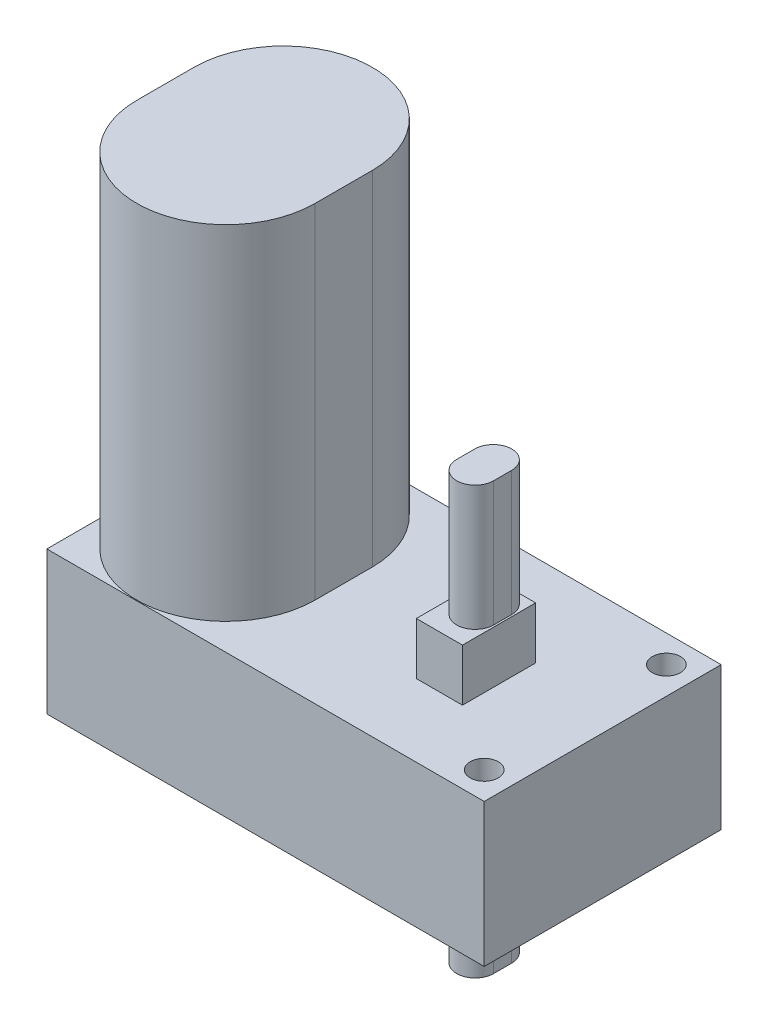
ISO-10303-21;
HEADER;
FILE_DESCRIPTION(('STEP AP214'),'2;1');
FILE_NAME('part.step','',(''),(''),'','','');
FILE_SCHEMA(('AUTOMOTIVE_DESIGN { 1 0 10303 214 1 1 1 1 }'));
ENDSEC;
DATA;
#1=APPLICATION_CONTEXT('core data for automotive mechanical design processes');
#2=APPLICATION_PROTOCOL_DEFINITION('international standard','automotive_design',2000,#1);
#3=PRODUCT_CONTEXT('',#1,'mechanical');
#4=PRODUCT('Part','Part','',(#3));
#5=PRODUCT_RELATED_PRODUCT_CATEGORY('part','',(#4));
#6=PRODUCT_DEFINITION_FORMATION('','',#4);
#7=PRODUCT_DEFINITION_CONTEXT('part definition',#1,'design');
#8=PRODUCT_DEFINITION('design','',#6,#7);
#9=PRODUCT_DEFINITION_SHAPE('','',#8);
#10=(LENGTH_UNIT() NAMED_UNIT(*) SI_UNIT(.MILLI.,.METRE.));
#11=(NAMED_UNIT(*) PLANE_ANGLE_UNIT() SI_UNIT($,.RADIAN.));
#12=(NAMED_UNIT(*) SI_UNIT($,.STERADIAN.) SOLID_ANGLE_UNIT());
#13=UNCERTAINTY_MEASURE_WITH_UNIT(LENGTH_MEASURE(1.E-05),#10,'distance_accuracy_value','');
#14=(GEOMETRIC_REPRESENTATION_CONTEXT(3) GLOBAL_UNCERTAINTY_ASSIGNED_CONTEXT((#13)) GLOBAL_UNIT_ASSIGNED_CONTEXT((#10,
#11,#12)) REPRESENTATION_CONTEXT('',''));
#15=CARTESIAN_POINT('',(0.,0.,0.));
#16=DIRECTION('',(0.,0.,1.));
#17=DIRECTION('',(1.,0.,0.));
#18=AXIS2_PLACEMENT_3D('',#15,#16,#17);
#19=CARTESIAN_POINT('',(0.,13.73,0.));
#20=DIRECTION('',(0.,-1.,0.));
#21=DIRECTION('',(0.,0.,-1.));
#22=AXIS2_PLACEMENT_3D('',#19,#20,#21);
#23=PLANE('',#22);
#24=CARTESIAN_POINT('',(-12.435,13.73,2.75));
#25=DIRECTION('',(0.,1.,0.));
#26=DIRECTION('',(0.,0.,1.));
#27=AXIS2_PLACEMENT_3D('',#24,#25,#26);
#28=CIRCLE('',#27,8.57);
#29=CARTESIAN_POINT('',(-21.005,13.73,2.75));
#30=VERTEX_POINT('',#29);
#31=CARTESIAN_POINT('',(-3.865,13.73,2.75));
#32=VERTEX_POINT('',#31);
#33=EDGE_CURVE('E241',#30,#32,#28,.T.);
#34=ORIENTED_EDGE('',*,*,#33,.F.);
#35=DIRECTION('',(0.,0.,1.));
#36=VECTOR('',#35,1.);
#37=CARTESIAN_POINT('',(-21.005,13.73,11.38));
#38=LINE('',#37,#36);
#39=CARTESIAN_POINT('',(-21.005,13.73,11.38));
#40=VERTEX_POINT('',#39);
#41=EDGE_CURVE('E345',#30,#40,#38,.T.);
#42=ORIENTED_EDGE('',*,*,#41,.T.);
#43=DIRECTION('',(1.,0.,0.));
#44=VECTOR('',#43,1.);
#45=CARTESIAN_POINT('',(-21.005,13.73,11.38));
#46=LINE('',#45,#44);
#47=CARTESIAN_POINT('',(21.005,13.73,11.38));
#48=VERTEX_POINT('',#47);
#49=EDGE_CURVE('E328',#40,#48,#46,.T.);
#50=ORIENTED_EDGE('',*,*,#49,.T.);
#51=DIRECTION('',(0.,0.,-1.));
#52=VECTOR('',#51,1.);
#53=CARTESIAN_POINT('',(21.005,13.73,11.38));
#54=LINE('',#53,#52);
#55=CARTESIAN_POINT('',(21.005,13.73,-11.38));
#56=VERTEX_POINT('',#55);
#57=EDGE_CURVE('E333',#48,#56,#54,.T.);
#58=ORIENTED_EDGE('',*,*,#57,.T.);
#59=DIRECTION('',(-1.,0.,0.));
#60=VECTOR('',#59,1.);
#61=CARTESIAN_POINT('',(-21.005,13.73,-11.38));
#62=LINE('',#61,#60);
#63=CARTESIAN_POINT('',(-21.005,13.73,-11.38));
#64=VERTEX_POINT('',#63);
#65=EDGE_CURVE('E349',#56,#64,#62,.T.);
#66=ORIENTED_EDGE('',*,*,#65,.T.);
#67=CARTESIAN_POINT('',(-21.005,13.73,-2.75));
#68=VERTEX_POINT('',#67);
#69=EDGE_CURVE('E343',#64,#68,#38,.T.);
#70=ORIENTED_EDGE('',*,*,#69,.T.);
#71=CARTESIAN_POINT('',(-12.435,13.73,-2.75));
#72=DIRECTION('',(0.,1.,0.));
#73=DIRECTION('',(0.,0.,1.));
#74=AXIS2_PLACEMENT_3D('',#71,#72,#73);
#75=CIRCLE('',#74,8.57);
#76=CARTESIAN_POINT('',(-3.86500000000001,13.73,-2.75));
#77=VERTEX_POINT('',#76);
#78=EDGE_CURVE('E258',#77,#68,#75,.T.);
#79=ORIENTED_EDGE('',*,*,#78,.F.);
#80=DIRECTION('',(0.,0.,-1.));
#81=VECTOR('',#80,1.);
#82=CARTESIAN_POINT('',(-3.865,13.73,2.75));
#83=LINE('',#82,#81);
#84=EDGE_CURVE('E265',#32,#77,#83,.T.);
#85=ORIENTED_EDGE('',*,*,#84,.F.);
#86=EDGE_LOOP('',(#34,#42,#50,#58,#66,#70,#79,#85));
#87=FACE_BOUND('',#86,.T.);
#88=CARTESIAN_POINT('',(18.375,13.73,-8.75));
#89=DIRECTION('',(0.,1.,0.));
#90=DIRECTION('',(0.,0.,1.));
#91=AXIS2_PLACEMENT_3D('',#88,#89,#90);
#92=CIRCLE('',#91,1.35);
#93=CARTESIAN_POINT('',(18.375,13.73,-7.4));
#94=VERTEX_POINT('',#93);
#95=EDGE_CURVE('E209',#94,#94,#92,.T.);
#96=ORIENTED_EDGE('',*,*,#95,.F.);
#97=EDGE_LOOP('',(#96));
#98=FACE_BOUND('',#97,.T.);
#99=CARTESIAN_POINT('',(18.375,13.73,8.75));
#100=DIRECTION('',(0.,1.,0.));
#101=DIRECTION('',(0.,0.,1.));
#102=AXIS2_PLACEMENT_3D('',#99,#100,#101);
#103=CIRCLE('',#102,1.35);
#104=CARTESIAN_POINT('',(18.375,13.73,10.1));
#105=VERTEX_POINT('',#104);
#106=EDGE_CURVE('E205',#105,#105,#103,.T.);
#107=ORIENTED_EDGE('',*,*,#106,.F.);
#108=EDGE_LOOP('',(#107));
#109=FACE_BOUND('',#108,.T.);
#110=DIRECTION('',(0.,0.,-1.));
#111=VECTOR('',#110,1.);
#112=CARTESIAN_POINT('',(11.9556320566407,13.73,4.418986760788));
#113=LINE('',#112,#111);
#114=CARTESIAN_POINT('',(11.9556320566407,13.73,4.418986760788));
#115=VERTEX_POINT('',#114);
#116=CARTESIAN_POINT('',(11.9556320566407,13.73,-2.60917707476871));
#117=VERTEX_POINT('',#116);
#118=EDGE_CURVE('E190',#115,#117,#113,.T.);
#119=ORIENTED_EDGE('',*,*,#118,.F.);
#120=DIRECTION('',(1.,0.,0.));
#121=VECTOR('',#120,1.);
#122=CARTESIAN_POINT('',(7.52449972946279,13.73,4.418986760788));
#123=LINE('',#122,#121);
#124=CARTESIAN_POINT('',(7.52449972946279,13.73,4.418986760788));
#125=VERTEX_POINT('',#124);
#126=EDGE_CURVE('E187',#125,#115,#123,.T.);
#127=ORIENTED_EDGE('',*,*,#126,.F.);
#128=DIRECTION('',(0.,0.,1.));
#129=VECTOR('',#128,1.);
#130=CARTESIAN_POINT('',(7.52449972946279,13.73,4.418986760788));
#131=LINE('',#130,#129);
#132=CARTESIAN_POINT('',(7.52449972946279,13.73,-2.60917707476871));
#133=VERTEX_POINT('',#132);
#134=EDGE_CURVE('E53',#133,#125,#131,.T.);
#135=ORIENTED_EDGE('',*,*,#134,.F.);
#136=DIRECTION('',(-1.,0.,0.));
#137=VECTOR('',#136,1.);
#138=CARTESIAN_POINT('',(7.52449972946279,13.73,-2.60917707476871));
#139=LINE('',#138,#137);
#140=EDGE_CURVE('E48',#117,#133,#139,.T.);
#141=ORIENTED_EDGE('',*,*,#140,.F.);
#142=EDGE_LOOP('',(#119,#127,#135,#141));
#143=FACE_BOUND('',#142,.T.);
#144=ADVANCED_FACE('F33',(#87,#98,#109,#143),#23,.F.);
#145=CARTESIAN_POINT('',(21.005,13.73,11.38));
#146=DIRECTION('',(-1.,0.,0.));
#147=DIRECTION('',(0.,0.,1.));
#148=AXIS2_PLACEMENT_3D('',#145,#146,#147);
#149=PLANE('',#148);
#150=DIRECTION('',(0.,0.,-1.));
#151=VECTOR('',#150,1.);
#152=CARTESIAN_POINT('',(21.005,0.,11.38));
#153=LINE('',#152,#151);
#154=CARTESIAN_POINT('',(21.005,0.,11.38));
#155=VERTEX_POINT('',#154);
#156=CARTESIAN_POINT('',(21.005,0.,-11.38));
#157=VERTEX_POINT('',#156);
#158=EDGE_CURVE('E314',#155,#157,#153,.T.);
#159=ORIENTED_EDGE('',*,*,#158,.T.);
#160=DIRECTION('',(0.,-1.,0.));
#161=VECTOR('',#160,1.);
#162=CARTESIAN_POINT('',(21.005,13.73,-11.38));
#163=LINE('',#162,#161);
#164=EDGE_CURVE('E287',#56,#157,#163,.T.);
#165=ORIENTED_EDGE('',*,*,#164,.F.);
#166=ORIENTED_EDGE('',*,*,#57,.F.);
#167=DIRECTION('',(0.,-1.,0.));
#168=VECTOR('',#167,1.);
#169=CARTESIAN_POINT('',(21.005,13.73,11.38));
#170=LINE('',#169,#168);
#171=EDGE_CURVE('E334',#48,#155,#170,.T.);
#172=ORIENTED_EDGE('',*,*,#171,.T.);
#173=EDGE_LOOP('',(#159,#165,#166,#172));
#174=FACE_BOUND('',#173,.T.);
#175=ADVANCED_FACE('F35',(#174),#149,.F.);
#176=CARTESIAN_POINT('',(-21.005,13.73,-11.38));
#177=DIRECTION('',(0.,0.,1.));
#178=DIRECTION('',(1.,0.,0.));
#179=AXIS2_PLACEMENT_3D('',#176,#177,#178);
#180=PLANE('',#179);
#181=DIRECTION('',(-1.,0.,0.));
#182=VECTOR('',#181,1.);
#183=CARTESIAN_POINT('',(-21.005,0.,-11.38));
#184=LINE('',#183,#182);
#185=CARTESIAN_POINT('',(-21.005,0.,-11.38));
#186=VERTEX_POINT('',#185);
#187=EDGE_CURVE('E317',#157,#186,#184,.T.);
#188=ORIENTED_EDGE('',*,*,#187,.T.);
#189=DIRECTION('',(0.,-1.,0.));
#190=VECTOR('',#189,1.);
#191=CARTESIAN_POINT('',(-21.005,13.73,-11.38));
#192=LINE('',#191,#190);
#193=EDGE_CURVE('E339',#64,#186,#192,.T.);
#194=ORIENTED_EDGE('',*,*,#193,.F.);
#195=ORIENTED_EDGE('',*,*,#65,.F.);
#196=ORIENTED_EDGE('',*,*,#164,.T.);
#197=EDGE_LOOP('',(#188,#194,#195,#196));
#198=FACE_BOUND('',#197,.T.);
#199=ADVANCED_FACE('F360',(#198),#180,.F.);
#200=CARTESIAN_POINT('',(-21.005,13.73,11.38));
#201=DIRECTION('',(1.,0.,0.));
#202=DIRECTION('',(0.,0.,-1.));
#203=AXIS2_PLACEMENT_3D('',#200,#201,#202);
#204=PLANE('',#203);
#205=DIRECTION('',(0.,0.,1.));
#206=VECTOR('',#205,1.);
#207=CARTESIAN_POINT('',(-21.005,0.,11.38));
#208=LINE('',#207,#206);
#209=CARTESIAN_POINT('',(-21.005,0.,11.38));
#210=VERTEX_POINT('',#209);
#211=EDGE_CURVE('E324',#186,#210,#208,.T.);
#212=ORIENTED_EDGE('',*,*,#211,.T.);
#213=DIRECTION('',(0.,-1.,0.));
#214=VECTOR('',#213,1.);
#215=CARTESIAN_POINT('',(-21.005,13.73,11.38));
#216=LINE('',#215,#214);
#217=EDGE_CURVE('E336',#40,#210,#216,.T.);
#218=ORIENTED_EDGE('',*,*,#217,.F.);
#219=ORIENTED_EDGE('',*,*,#41,.F.);
#220=DIRECTION('',(0.,-1.,0.));
#221=VECTOR('',#220,1.);
#222=CARTESIAN_POINT('',(-21.005,46.73,2.75));
#223=LINE('',#222,#221);
#224=CARTESIAN_POINT('',(-21.005,46.73,2.75));
#225=VERTEX_POINT('',#224);
#226=EDGE_CURVE('E264',#225,#30,#223,.T.);
#227=ORIENTED_EDGE('',*,*,#226,.F.);
#228=DIRECTION('',(0.,0.,1.));
#229=VECTOR('',#228,1.);
#230=CARTESIAN_POINT('',(-21.005,46.73,2.75));
#231=LINE('',#230,#229);
#232=CARTESIAN_POINT('',(-21.005,46.73,-2.75));
#233=VERTEX_POINT('',#232);
#234=EDGE_CURVE('E262',#233,#225,#231,.T.);
#235=ORIENTED_EDGE('',*,*,#234,.F.);
#236=DIRECTION('',(0.,-1.,0.));
#237=VECTOR('',#236,1.);
#238=CARTESIAN_POINT('',(-21.005,46.73,-2.75));
#239=LINE('',#238,#237);
#240=EDGE_CURVE('E278',#233,#68,#239,.T.);
#241=ORIENTED_EDGE('',*,*,#240,.T.);
#242=ORIENTED_EDGE('',*,*,#69,.F.);
#243=ORIENTED_EDGE('',*,*,#193,.T.);
#244=EDGE_LOOP('',(#212,#218,#219,#227,#235,#241,#242,#243));
#245=FACE_BOUND('',#244,.T.);
#246=ADVANCED_FACE('F363',(#245),#204,.F.);
#247=CARTESIAN_POINT('',(-21.005,13.73,11.38));
#248=DIRECTION('',(0.,0.,-1.));
#249=DIRECTION('',(-1.,0.,0.));
#250=AXIS2_PLACEMENT_3D('',#247,#248,#249);
#251=PLANE('',#250);
#252=DIRECTION('',(1.,0.,0.));
#253=VECTOR('',#252,1.);
#254=CARTESIAN_POINT('',(-21.005,0.,11.38));
#255=LINE('',#254,#253);
#256=EDGE_CURVE('E316',#210,#155,#255,.T.);
#257=ORIENTED_EDGE('',*,*,#256,.T.);
#258=ORIENTED_EDGE('',*,*,#171,.F.);
#259=ORIENTED_EDGE('',*,*,#49,.F.);
#260=ORIENTED_EDGE('',*,*,#217,.T.);
#261=EDGE_LOOP('',(#257,#258,#259,#260));
#262=FACE_BOUND('',#261,.T.);
#263=ADVANCED_FACE('F306',(#262),#251,.F.);
#264=CARTESIAN_POINT('',(0.,0.,0.));
#265=DIRECTION('',(0.,-1.,0.));
#266=DIRECTION('',(0.,0.,-1.));
#267=AXIS2_PLACEMENT_3D('',#264,#265,#266);
#268=PLANE('',#267);
#269=CARTESIAN_POINT('',(18.375,0.,8.75));
#270=DIRECTION('',(0.,-1.,0.));
#271=DIRECTION('',(0.,0.,-1.));
#272=AXIS2_PLACEMENT_3D('',#269,#270,#271);
#273=CIRCLE('',#272,1.35);
#274=CARTESIAN_POINT('',(18.375,0.,7.4));
#275=VERTEX_POINT('',#274);
#276=EDGE_CURVE('E208',#275,#275,#273,.T.);
#277=ORIENTED_EDGE('',*,*,#276,.F.);
#278=EDGE_LOOP('',(#277));
#279=FACE_BOUND('',#278,.T.);
#280=CARTESIAN_POINT('',(18.375,0.,-8.75));
#281=DIRECTION('',(0.,-1.,0.));
#282=DIRECTION('',(0.,0.,-1.));
#283=AXIS2_PLACEMENT_3D('',#280,#281,#282);
#284=CIRCLE('',#283,1.35);
#285=CARTESIAN_POINT('',(18.375,0.,-10.1));
#286=VERTEX_POINT('',#285);
#287=EDGE_CURVE('E212',#286,#286,#284,.T.);
#288=ORIENTED_EDGE('',*,*,#287,.F.);
#289=EDGE_LOOP('',(#288));
#290=FACE_BOUND('',#289,.T.);
#291=CARTESIAN_POINT('',(10.005,0.,1.25));
#292=DIRECTION('',(0.,-1.,0.));
#293=DIRECTION('',(0.,0.,-1.));
#294=AXIS2_PLACEMENT_3D('',#291,#292,#293);
#295=CIRCLE('',#294,1.775);
#296=CARTESIAN_POINT('',(11.78,0.,1.25));
#297=VERTEX_POINT('',#296);
#298=CARTESIAN_POINT('',(8.22999999999999,0.,1.25));
#299=VERTEX_POINT('',#298);
#300=EDGE_CURVE('E41',#297,#299,#295,.T.);
#301=ORIENTED_EDGE('',*,*,#300,.F.);
#302=DIRECTION('',(0.,0.,1.));
#303=VECTOR('',#302,1.);
#304=CARTESIAN_POINT('',(11.78,0.,0.));
#305=LINE('',#304,#303);
#306=CARTESIAN_POINT('',(11.78,0.,-0.489999999999997));
#307=VERTEX_POINT('',#306);
#308=EDGE_CURVE('E283',#307,#297,#305,.T.);
#309=ORIENTED_EDGE('',*,*,#308,.F.);
#310=CARTESIAN_POINT('',(10.005,0.,-0.489999999999996));
#311=DIRECTION('',(0.,-1.,0.));
#312=DIRECTION('',(0.,0.,-1.));
#313=AXIS2_PLACEMENT_3D('',#310,#311,#312);
#314=CIRCLE('',#313,1.775);
#315=CARTESIAN_POINT('',(8.22999999999999,0.,-0.489999999999996));
#316=VERTEX_POINT('',#315);
#317=EDGE_CURVE('E286',#316,#307,#314,.T.);
#318=ORIENTED_EDGE('',*,*,#317,.F.);
#319=DIRECTION('',(0.,0.,-1.));
#320=VECTOR('',#319,1.);
#321=CARTESIAN_POINT('',(8.22999999999999,0.,0.));
#322=LINE('',#321,#320);
#323=EDGE_CURVE('E290',#299,#316,#322,.T.);
#324=ORIENTED_EDGE('',*,*,#323,.F.);
#325=EDGE_LOOP('',(#301,#309,#318,#324));
#326=FACE_BOUND('',#325,.T.);
#327=ORIENTED_EDGE('',*,*,#158,.F.);
#328=ORIENTED_EDGE('',*,*,#256,.F.);
#329=ORIENTED_EDGE('',*,*,#211,.F.);
#330=ORIENTED_EDGE('',*,*,#187,.F.);
#331=EDGE_LOOP('',(#327,#328,#329,#330));
#332=FACE_BOUND('',#331,.T.);
#333=ADVANCED_FACE('F302',(#279,#290,#326,#332),#268,.T.);
#334=CARTESIAN_POINT('',(-12.435,46.73,2.75));
#335=DIRECTION('',(0.,-1.,0.));
#336=DIRECTION('',(0.,0.,-1.));
#337=AXIS2_PLACEMENT_3D('',#334,#335,#336);
#338=CYLINDRICAL_SURFACE('',#337,8.57);
#339=ORIENTED_EDGE('',*,*,#33,.T.);
#340=DIRECTION('',(0.,-1.,0.));
#341=VECTOR('',#340,1.);
#342=CARTESIAN_POINT('',(-3.865,46.73,2.75));
#343=LINE('',#342,#341);
#344=CARTESIAN_POINT('',(-3.865,46.73,2.75));
#345=VERTEX_POINT('',#344);
#346=EDGE_CURVE('E322',#345,#32,#343,.T.);
#347=ORIENTED_EDGE('',*,*,#346,.F.);
#348=CARTESIAN_POINT('',(-12.435,46.73,2.75));
#349=DIRECTION('',(0.,1.,0.));
#350=DIRECTION('',(0.,0.,1.));
#351=AXIS2_PLACEMENT_3D('',#348,#349,#350);
#352=CIRCLE('',#351,8.57);
#353=EDGE_CURVE('E254',#225,#345,#352,.T.);
#354=ORIENTED_EDGE('',*,*,#353,.F.);
#355=ORIENTED_EDGE('',*,*,#226,.T.);
#356=EDGE_LOOP('',(#339,#347,#354,#355));
#357=FACE_BOUND('',#356,.T.);
#358=ADVANCED_FACE('F305',(#357),#338,.T.);
#359=CARTESIAN_POINT('',(-3.865,46.73,2.75));
#360=DIRECTION('',(-1.,0.,0.));
#361=DIRECTION('',(0.,0.,1.));
#362=AXIS2_PLACEMENT_3D('',#359,#360,#361);
#363=PLANE('',#362);
#364=ORIENTED_EDGE('',*,*,#84,.T.);
#365=DIRECTION('',(0.,-1.,0.));
#366=VECTOR('',#365,1.);
#367=CARTESIAN_POINT('',(-3.86500000000001,46.73,-2.75));
#368=LINE('',#367,#366);
#369=CARTESIAN_POINT('',(-3.86500000000001,46.73,-2.75));
#370=VERTEX_POINT('',#369);
#371=EDGE_CURVE('E270',#370,#77,#368,.T.);
#372=ORIENTED_EDGE('',*,*,#371,.F.);
#373=DIRECTION('',(0.,0.,-1.));
#374=VECTOR('',#373,1.);
#375=CARTESIAN_POINT('',(-3.865,46.73,2.75));
#376=LINE('',#375,#374);
#377=EDGE_CURVE('E257',#345,#370,#376,.T.);
#378=ORIENTED_EDGE('',*,*,#377,.F.);
#379=ORIENTED_EDGE('',*,*,#346,.T.);
#380=EDGE_LOOP('',(#364,#372,#378,#379));
#381=FACE_BOUND('',#380,.T.);
#382=ADVANCED_FACE('F372',(#381),#363,.F.);
#383=CARTESIAN_POINT('',(-12.435,46.73,-2.75));
#384=DIRECTION('',(0.,-1.,0.));
#385=DIRECTION('',(0.,0.,-1.));
#386=AXIS2_PLACEMENT_3D('',#383,#384,#385);
#387=CYLINDRICAL_SURFACE('',#386,8.57);
#388=ORIENTED_EDGE('',*,*,#78,.T.);
#389=ORIENTED_EDGE('',*,*,#240,.F.);
#390=CARTESIAN_POINT('',(-12.435,46.73,-2.75));
#391=DIRECTION('',(0.,1.,0.));
#392=DIRECTION('',(0.,0.,1.));
#393=AXIS2_PLACEMENT_3D('',#390,#391,#392);
#394=CIRCLE('',#393,8.57);
#395=EDGE_CURVE('E260',#370,#233,#394,.T.);
#396=ORIENTED_EDGE('',*,*,#395,.F.);
#397=ORIENTED_EDGE('',*,*,#371,.T.);
#398=EDGE_LOOP('',(#388,#389,#396,#397));
#399=FACE_BOUND('',#398,.T.);
#400=ADVANCED_FACE('F368',(#399),#387,.T.);
#401=CARTESIAN_POINT('',(-12.435,46.73,2.75));
#402=DIRECTION('',(0.,1.,0.));
#403=DIRECTION('',(0.,0.,1.));
#404=AXIS2_PLACEMENT_3D('',#401,#402,#403);
#405=PLANE('',#404);
#406=ORIENTED_EDGE('',*,*,#353,.T.);
#407=ORIENTED_EDGE('',*,*,#377,.T.);
#408=ORIENTED_EDGE('',*,*,#395,.T.);
#409=ORIENTED_EDGE('',*,*,#234,.T.);
#410=EDGE_LOOP('',(#406,#407,#408,#409));
#411=FACE_BOUND('',#410,.T.);
#412=ADVANCED_FACE('F384',(#411),#405,.T.);
#413=CARTESIAN_POINT('',(10.005,-10.27,1.25));
#414=DIRECTION('',(0.,1.,0.));
#415=DIRECTION('',(0.,0.,1.));
#416=AXIS2_PLACEMENT_3D('',#413,#414,#415);
#417=PLANE('',#416);
#418=CARTESIAN_POINT('',(10.005,-10.27,1.25));
#419=DIRECTION('',(0.,1.,0.));
#420=DIRECTION('',(0.,0.,1.));
#421=AXIS2_PLACEMENT_3D('',#418,#419,#420);
#422=CIRCLE('',#421,1.775);
#423=CARTESIAN_POINT('',(8.22999999999999,-10.27,1.25));
#424=VERTEX_POINT('',#423);
#425=CARTESIAN_POINT('',(11.78,-10.27,1.25));
#426=VERTEX_POINT('',#425);
#427=EDGE_CURVE('E225',#424,#426,#422,.T.);
#428=ORIENTED_EDGE('',*,*,#427,.F.);
#429=DIRECTION('',(0.,0.,1.));
#430=VECTOR('',#429,1.);
#431=CARTESIAN_POINT('',(8.22999999999999,-10.27,1.25));
#432=LINE('',#431,#430);
#433=CARTESIAN_POINT('',(8.22999999999999,-10.27,-0.489999999999996));
#434=VERTEX_POINT('',#433);
#435=EDGE_CURVE('E234',#434,#424,#432,.T.);
#436=ORIENTED_EDGE('',*,*,#435,.F.);
#437=CARTESIAN_POINT('',(10.005,-10.27,-0.489999999999996));
#438=DIRECTION('',(0.,1.,0.));
#439=DIRECTION('',(0.,0.,1.));
#440=AXIS2_PLACEMENT_3D('',#437,#438,#439);
#441=CIRCLE('',#440,1.775);
#442=CARTESIAN_POINT('',(11.78,-10.27,-0.489999999999997));
#443=VERTEX_POINT('',#442);
#444=EDGE_CURVE('E231',#443,#434,#441,.T.);
#445=ORIENTED_EDGE('',*,*,#444,.F.);
#446=DIRECTION('',(0.,0.,-1.));
#447=VECTOR('',#446,1.);
#448=CARTESIAN_POINT('',(11.78,-10.27,1.25));
#449=LINE('',#448,#447);
#450=EDGE_CURVE('E228',#426,#443,#449,.T.);
#451=ORIENTED_EDGE('',*,*,#450,.F.);
#452=EDGE_LOOP('',(#428,#436,#445,#451));
#453=FACE_BOUND('',#452,.T.);
#454=ADVANCED_FACE('F386',(#453),#417,.F.);
#455=CARTESIAN_POINT('',(11.78,-10.27,1.25));
#456=DIRECTION('',(1.,0.,0.));
#457=DIRECTION('',(0.,0.,-1.));
#458=AXIS2_PLACEMENT_3D('',#455,#456,#457);
#459=PLANE('',#458);
#460=DIRECTION('',(0.,1.,0.));
#461=VECTOR('',#460,1.);
#462=CARTESIAN_POINT('',(11.78,-10.27,-0.489999999999997));
#463=LINE('',#462,#461);
#464=EDGE_CURVE('E247',#443,#307,#463,.T.);
#465=ORIENTED_EDGE('',*,*,#464,.T.);
#466=ORIENTED_EDGE('',*,*,#308,.T.);
#467=DIRECTION('',(0.,1.,0.));
#468=VECTOR('',#467,1.);
#469=CARTESIAN_POINT('',(11.78,-10.27,1.25));
#470=LINE('',#469,#468);
#471=EDGE_CURVE('E251',#426,#297,#470,.T.);
#472=ORIENTED_EDGE('',*,*,#471,.F.);
#473=ORIENTED_EDGE('',*,*,#450,.T.);
#474=EDGE_LOOP('',(#465,#466,#472,#473));
#475=FACE_BOUND('',#474,.T.);
#476=ADVANCED_FACE('F392',(#475),#459,.T.);
#477=CARTESIAN_POINT('',(10.005,-10.27,-0.489999999999996));
#478=DIRECTION('',(0.,1.,0.));
#479=DIRECTION('',(0.,0.,1.));
#480=AXIS2_PLACEMENT_3D('',#477,#478,#479);
#481=CYLINDRICAL_SURFACE('',#480,1.775);
#482=DIRECTION('',(0.,1.,0.));
#483=VECTOR('',#482,1.);
#484=CARTESIAN_POINT('',(8.22999999999999,-10.27,-0.489999999999996));
#485=LINE('',#484,#483);
#486=EDGE_CURVE('E243',#434,#316,#485,.T.);
#487=ORIENTED_EDGE('',*,*,#486,.T.);
#488=ORIENTED_EDGE('',*,*,#317,.T.);
#489=ORIENTED_EDGE('',*,*,#464,.F.);
#490=ORIENTED_EDGE('',*,*,#444,.T.);
#491=EDGE_LOOP('',(#487,#488,#489,#490));
#492=FACE_BOUND('',#491,.T.);
#493=ADVANCED_FACE('F465',(#492),#481,.T.);
#494=CARTESIAN_POINT('',(8.22999999999999,-10.27,1.25));
#495=DIRECTION('',(-1.,0.,0.));
#496=DIRECTION('',(0.,0.,1.));
#497=AXIS2_PLACEMENT_3D('',#494,#495,#496);
#498=PLANE('',#497);
#499=DIRECTION('',(0.,1.,0.));
#500=VECTOR('',#499,1.);
#501=CARTESIAN_POINT('',(8.22999999999999,-10.27,1.25));
#502=LINE('',#501,#500);
#503=EDGE_CURVE('E238',#424,#299,#502,.T.);
#504=ORIENTED_EDGE('',*,*,#503,.T.);
#505=ORIENTED_EDGE('',*,*,#323,.T.);
#506=ORIENTED_EDGE('',*,*,#486,.F.);
#507=ORIENTED_EDGE('',*,*,#435,.T.);
#508=EDGE_LOOP('',(#504,#505,#506,#507));
#509=FACE_BOUND('',#508,.T.);
#510=ADVANCED_FACE('F476',(#509),#498,.T.);
#511=CARTESIAN_POINT('',(10.005,-10.27,1.25));
#512=DIRECTION('',(0.,1.,0.));
#513=DIRECTION('',(0.,0.,1.));
#514=AXIS2_PLACEMENT_3D('',#511,#512,#513);
#515=CYLINDRICAL_SURFACE('',#514,1.775);
#516=ORIENTED_EDGE('',*,*,#471,.T.);
#517=ORIENTED_EDGE('',*,*,#300,.T.);
#518=ORIENTED_EDGE('',*,*,#503,.F.);
#519=ORIENTED_EDGE('',*,*,#427,.T.);
#520=EDGE_LOOP('',(#516,#517,#518,#519));
#521=FACE_BOUND('',#520,.T.);
#522=ADVANCED_FACE('F487',(#521),#515,.T.);
#523=CARTESIAN_POINT('',(18.375,-3.27,-8.75));
#524=DIRECTION('',(0.,1.,0.));
#525=DIRECTION('',(0.,0.,1.));
#526=AXIS2_PLACEMENT_3D('',#523,#524,#525);
#527=CYLINDRICAL_SURFACE('',#526,1.35);
#528=ORIENTED_EDGE('',*,*,#287,.T.);
#529=EDGE_LOOP('',(#528));
#530=FACE_BOUND('',#529,.T.);
#531=ORIENTED_EDGE('',*,*,#95,.T.);
#532=EDGE_LOOP('',(#531));
#533=FACE_BOUND('',#532,.T.);
#534=ADVANCED_FACE('F497',(#530,#533),#527,.F.);
#535=CARTESIAN_POINT('',(18.375,-3.27,8.75));
#536=DIRECTION('',(0.,1.,0.));
#537=DIRECTION('',(0.,0.,1.));
#538=AXIS2_PLACEMENT_3D('',#535,#536,#537);
#539=CYLINDRICAL_SURFACE('',#538,1.35);
#540=ORIENTED_EDGE('',*,*,#276,.T.);
#541=EDGE_LOOP('',(#540));
#542=FACE_BOUND('',#541,.T.);
#543=ORIENTED_EDGE('',*,*,#106,.T.);
#544=EDGE_LOOP('',(#543));
#545=FACE_BOUND('',#544,.T.);
#546=ADVANCED_FACE('F299',(#542,#545),#539,.F.);
#547=CARTESIAN_POINT('',(11.9556320566407,18.73,4.418986760788));
#548=DIRECTION('',(-1.,0.,0.));
#549=DIRECTION('',(0.,0.,1.));
#550=AXIS2_PLACEMENT_3D('',#547,#548,#549);
#551=PLANE('',#550);
#552=ORIENTED_EDGE('',*,*,#118,.T.);
#553=DIRECTION('',(0.,-1.,0.));
#554=VECTOR('',#553,1.);
#555=CARTESIAN_POINT('',(11.9556320566407,18.73,-2.60917707476871));
#556=LINE('',#555,#554);
#557=CARTESIAN_POINT('',(11.9556320566407,18.73,-2.60917707476871));
#558=VERTEX_POINT('',#557);
#559=EDGE_CURVE('E171',#558,#117,#556,.T.);
#560=ORIENTED_EDGE('',*,*,#559,.F.);
#561=DIRECTION('',(0.,0.,-1.));
#562=VECTOR('',#561,1.);
#563=CARTESIAN_POINT('',(11.9556320566407,18.73,4.418986760788));
#564=LINE('',#563,#562);
#565=CARTESIAN_POINT('',(11.9556320566407,18.73,4.418986760788));
#566=VERTEX_POINT('',#565);
#567=EDGE_CURVE('E178',#566,#558,#564,.T.);
#568=ORIENTED_EDGE('',*,*,#567,.F.);
#569=DIRECTION('',(0.,-1.,0.));
#570=VECTOR('',#569,1.);
#571=CARTESIAN_POINT('',(11.9556320566407,18.73,4.418986760788));
#572=LINE('',#571,#570);
#573=EDGE_CURVE('E613',#566,#115,#572,.T.);
#574=ORIENTED_EDGE('',*,*,#573,.T.);
#575=EDGE_LOOP('',(#552,#560,#568,#574));
#576=FACE_BOUND('',#575,.T.);
#577=ADVANCED_FACE('F189',(#576),#551,.F.);
#578=CARTESIAN_POINT('',(7.52449972946279,18.73,-2.60917707476871));
#579=DIRECTION('',(0.,0.,1.));
#580=DIRECTION('',(1.,0.,0.));
#581=AXIS2_PLACEMENT_3D('',#578,#579,#580);
#582=PLANE('',#581);
#583=ORIENTED_EDGE('',*,*,#140,.T.);
#584=DIRECTION('',(0.,-1.,0.));
#585=VECTOR('',#584,1.);
#586=CARTESIAN_POINT('',(7.52449972946279,18.73,-2.60917707476871));
#587=LINE('',#586,#585);
#588=CARTESIAN_POINT('',(7.52449972946279,18.73,-2.60917707476871));
#589=VERTEX_POINT('',#588);
#590=EDGE_CURVE('E174',#589,#133,#587,.T.);
#591=ORIENTED_EDGE('',*,*,#590,.F.);
#592=DIRECTION('',(-1.,0.,0.));
#593=VECTOR('',#592,1.);
#594=CARTESIAN_POINT('',(7.52449972946279,18.73,-2.60917707476871));
#595=LINE('',#594,#593);
#596=EDGE_CURVE('E167',#558,#589,#595,.T.);
#597=ORIENTED_EDGE('',*,*,#596,.F.);
#598=ORIENTED_EDGE('',*,*,#559,.T.);
#599=EDGE_LOOP('',(#583,#591,#597,#598));
#600=FACE_BOUND('',#599,.T.);
#601=ADVANCED_FACE('F169',(#600),#582,.F.);
#602=CARTESIAN_POINT('',(7.52449972946279,18.73,4.418986760788));
#603=DIRECTION('',(1.,0.,0.));
#604=DIRECTION('',(0.,0.,-1.));
#605=AXIS2_PLACEMENT_3D('',#602,#603,#604);
#606=PLANE('',#605);
#607=ORIENTED_EDGE('',*,*,#134,.T.);
#608=DIRECTION('',(0.,-1.,0.));
#609=VECTOR('',#608,1.);
#610=CARTESIAN_POINT('',(7.52449972946279,18.73,4.418986760788));
#611=LINE('',#610,#609);
#612=CARTESIAN_POINT('',(7.52449972946279,18.73,4.418986760788));
#613=VERTEX_POINT('',#612);
#614=EDGE_CURVE('E196',#613,#125,#611,.T.);
#615=ORIENTED_EDGE('',*,*,#614,.F.);
#616=DIRECTION('',(0.,0.,1.));
#617=VECTOR('',#616,1.);
#618=CARTESIAN_POINT('',(7.52449972946279,18.73,4.418986760788));
#619=LINE('',#618,#617);
#620=EDGE_CURVE('E177',#589,#613,#619,.T.);
#621=ORIENTED_EDGE('',*,*,#620,.F.);
#622=ORIENTED_EDGE('',*,*,#590,.T.);
#623=EDGE_LOOP('',(#607,#615,#621,#622));
#624=FACE_BOUND('',#623,.T.);
#625=ADVANCED_FACE('F564',(#624),#606,.F.);
#626=CARTESIAN_POINT('',(7.52449972946279,18.73,4.418986760788));
#627=DIRECTION('',(0.,0.,-1.));
#628=DIRECTION('',(-1.,0.,0.));
#629=AXIS2_PLACEMENT_3D('',#626,#627,#628);
#630=PLANE('',#629);
#631=ORIENTED_EDGE('',*,*,#126,.T.);
#632=ORIENTED_EDGE('',*,*,#573,.F.);
#633=DIRECTION('',(1.,0.,0.));
#634=VECTOR('',#633,1.);
#635=CARTESIAN_POINT('',(7.52449972946279,18.73,4.418986760788));
#636=LINE('',#635,#634);
#637=EDGE_CURVE('E183',#613,#566,#636,.T.);
#638=ORIENTED_EDGE('',*,*,#637,.F.);
#639=ORIENTED_EDGE('',*,*,#614,.T.);
#640=EDGE_LOOP('',(#631,#632,#638,#639));
#641=FACE_BOUND('',#640,.T.);
#642=ADVANCED_FACE('F571',(#641),#630,.F.);
#643=CARTESIAN_POINT('',(0.,18.73,0.));
#644=DIRECTION('',(0.,-1.,0.));
#645=DIRECTION('',(0.,0.,-1.));
#646=AXIS2_PLACEMENT_3D('',#643,#644,#645);
#647=PLANE('',#646);
#648=CARTESIAN_POINT('',(10.005,18.73,1.25));
#649=DIRECTION('',(0.,-1.,0.));
#650=DIRECTION('',(0.,0.,-1.));
#651=AXIS2_PLACEMENT_3D('',#648,#649,#650);
#652=CIRCLE('',#651,1.775);
#653=CARTESIAN_POINT('',(8.22999999999999,18.73,1.25));
#654=VERTEX_POINT('',#653);
#655=CARTESIAN_POINT('',(11.78,18.73,1.25));
#656=VERTEX_POINT('',#655);
#657=EDGE_CURVE('E202',#654,#656,#652,.F.);
#658=ORIENTED_EDGE('',*,*,#657,.F.);
#659=DIRECTION('',(0.,0.,1.));
#660=VECTOR('',#659,1.);
#661=CARTESIAN_POINT('',(8.22999999999999,18.73,1.25));
#662=LINE('',#661,#660);
#663=CARTESIAN_POINT('',(8.22999999999999,18.73,-0.489999999999996));
#664=VERTEX_POINT('',#663);
#665=EDGE_CURVE('E194',#664,#654,#662,.T.);
#666=ORIENTED_EDGE('',*,*,#665,.F.);
#667=CARTESIAN_POINT('',(10.005,18.73,-0.489999999999996));
#668=DIRECTION('',(0.,-1.,0.));
#669=DIRECTION('',(0.,0.,-1.));
#670=AXIS2_PLACEMENT_3D('',#667,#668,#669);
#671=CIRCLE('',#670,1.775);
#672=CARTESIAN_POINT('',(11.78,18.73,-0.489999999999997));
#673=VERTEX_POINT('',#672);
#674=EDGE_CURVE('E191',#673,#664,#671,.F.);
#675=ORIENTED_EDGE('',*,*,#674,.F.);
#676=DIRECTION('',(0.,0.,-1.));
#677=VECTOR('',#676,1.);
#678=CARTESIAN_POINT('',(11.78,18.73,1.25));
#679=LINE('',#678,#677);
#680=EDGE_CURVE('E11',#656,#673,#679,.T.);
#681=ORIENTED_EDGE('',*,*,#680,.F.);
#682=EDGE_LOOP('',(#658,#666,#675,#681));
#683=FACE_BOUND('',#682,.T.);
#684=ORIENTED_EDGE('',*,*,#567,.T.);
#685=ORIENTED_EDGE('',*,*,#596,.T.);
#686=ORIENTED_EDGE('',*,*,#620,.T.);
#687=ORIENTED_EDGE('',*,*,#637,.T.);
#688=EDGE_LOOP('',(#684,#685,#686,#687));
#689=FACE_BOUND('',#688,.T.);
#690=ADVANCED_FACE('F181',(#683,#689),#647,.F.);
#691=CARTESIAN_POINT('',(10.005,30.73,1.25));
#692=DIRECTION('',(0.,1.,0.));
#693=DIRECTION('',(0.,0.,1.));
#694=AXIS2_PLACEMENT_3D('',#691,#692,#693);
#695=PLANE('',#694);
#696=CARTESIAN_POINT('',(10.005,30.73,1.25));
#697=DIRECTION('',(0.,1.,0.));
#698=DIRECTION('',(0.,0.,1.));
#699=AXIS2_PLACEMENT_3D('',#696,#697,#698);
#700=CIRCLE('',#699,1.775);
#701=CARTESIAN_POINT('',(8.22999999999999,30.73,1.25));
#702=VERTEX_POINT('',#701);
#703=CARTESIAN_POINT('',(11.78,30.73,1.25));
#704=VERTEX_POINT('',#703);
#705=EDGE_CURVE('E213',#702,#704,#700,.T.);
#706=ORIENTED_EDGE('',*,*,#705,.T.);
#707=DIRECTION('',(0.,0.,-1.));
#708=VECTOR('',#707,1.);
#709=CARTESIAN_POINT('',(11.78,30.73,1.25));
#710=LINE('',#709,#708);
#711=CARTESIAN_POINT('',(11.78,30.73,-0.489999999999997));
#712=VERTEX_POINT('',#711);
#713=EDGE_CURVE('E216',#704,#712,#710,.T.);
#714=ORIENTED_EDGE('',*,*,#713,.T.);
#715=CARTESIAN_POINT('',(10.005,30.73,-0.489999999999996));
#716=DIRECTION('',(0.,1.,0.));
#717=DIRECTION('',(0.,0.,1.));
#718=AXIS2_PLACEMENT_3D('',#715,#716,#717);
#719=CIRCLE('',#718,1.775);
#720=CARTESIAN_POINT('',(8.22999999999999,30.73,-0.489999999999996));
#721=VERTEX_POINT('',#720);
#722=EDGE_CURVE('E219',#712,#721,#719,.T.);
#723=ORIENTED_EDGE('',*,*,#722,.T.);
#724=DIRECTION('',(0.,0.,1.));
#725=VECTOR('',#724,1.);
#726=CARTESIAN_POINT('',(8.22999999999999,30.73,1.25));
#727=LINE('',#726,#725);
#728=EDGE_CURVE('E222',#721,#702,#727,.T.);
#729=ORIENTED_EDGE('',*,*,#728,.T.);
#730=EDGE_LOOP('',(#706,#714,#723,#729));
#731=FACE_BOUND('',#730,.T.);
#732=ADVANCED_FACE('F505',(#731),#695,.T.);
#733=EDGE_CURVE('E237',#656,#704,#470,.T.);
#734=ORIENTED_EDGE('',*,*,#733,.F.);
#735=ORIENTED_EDGE('',*,*,#680,.T.);
#736=EDGE_CURVE('E250',#673,#712,#463,.T.);
#737=ORIENTED_EDGE('',*,*,#736,.T.);
#738=ORIENTED_EDGE('',*,*,#713,.F.);
#739=EDGE_LOOP('',(#734,#735,#737,#738));
#740=FACE_BOUND('',#739,.T.);
#741=ADVANCED_FACE('F468',(#740),#459,.T.);
#742=ORIENTED_EDGE('',*,*,#736,.F.);
#743=ORIENTED_EDGE('',*,*,#674,.T.);
#744=EDGE_CURVE('E246',#664,#721,#485,.T.);
#745=ORIENTED_EDGE('',*,*,#744,.T.);
#746=ORIENTED_EDGE('',*,*,#722,.F.);
#747=EDGE_LOOP('',(#742,#743,#745,#746));
#748=FACE_BOUND('',#747,.T.);
#749=ADVANCED_FACE('F479',(#748),#481,.T.);
#750=ORIENTED_EDGE('',*,*,#744,.F.);
#751=ORIENTED_EDGE('',*,*,#665,.T.);
#752=EDGE_CURVE('E242',#654,#702,#502,.T.);
#753=ORIENTED_EDGE('',*,*,#752,.T.);
#754=ORIENTED_EDGE('',*,*,#728,.F.);
#755=EDGE_LOOP('',(#750,#751,#753,#754));
#756=FACE_BOUND('',#755,.T.);
#757=ADVANCED_FACE('F490',(#756),#498,.T.);
#758=ORIENTED_EDGE('',*,*,#752,.F.);
#759=ORIENTED_EDGE('',*,*,#657,.T.);
#760=ORIENTED_EDGE('',*,*,#733,.T.);
#761=ORIENTED_EDGE('',*,*,#705,.F.);
#762=EDGE_LOOP('',(#758,#759,#760,#761));
#763=FACE_BOUND('',#762,.T.);
#764=ADVANCED_FACE('F499',(#763),#515,.T.);
#765=CLOSED_SHELL('',(#144,#175,#199,#246,#263,#333,#358,#382,#400,#412,#454,#476,#493,#510,
#522,#534,#546,#577,#601,#625,#642,#690,#732,#741,#749,#757,#764));
#766=MANIFOLD_SOLID_BREP('B2',#765);
#767=ADVANCED_BREP_SHAPE_REPRESENTATION('',(#18,#766),#14);
#768=SHAPE_DEFINITION_REPRESENTATION(#9,#767);
ENDSEC;
END-ISO-10303-21;
